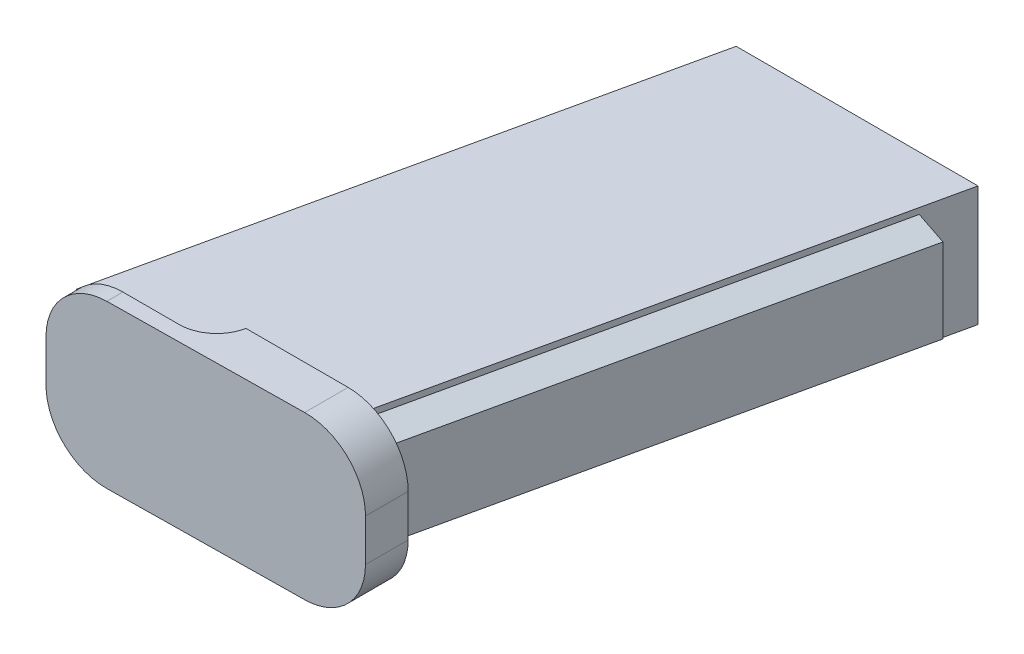
ISO-10303-21;
HEADER;
FILE_DESCRIPTION(('STEP AP214'),'2;1');
FILE_NAME('part.step','',(''),(''),'','','');
FILE_SCHEMA(('AUTOMOTIVE_DESIGN { 1 0 10303 214 1 1 1 1 }'));
ENDSEC;
DATA;
#1=APPLICATION_CONTEXT('core data for automotive mechanical design processes');
#2=APPLICATION_PROTOCOL_DEFINITION('international standard','automotive_design',2000,#1);
#3=PRODUCT_CONTEXT('',#1,'mechanical');
#4=PRODUCT('Part','Part','',(#3));
#5=PRODUCT_RELATED_PRODUCT_CATEGORY('part','',(#4));
#6=PRODUCT_DEFINITION_FORMATION('','',#4);
#7=PRODUCT_DEFINITION_CONTEXT('part definition',#1,'design');
#8=PRODUCT_DEFINITION('design','',#6,#7);
#9=PRODUCT_DEFINITION_SHAPE('','',#8);
#10=(LENGTH_UNIT() NAMED_UNIT(*) SI_UNIT(.MILLI.,.METRE.));
#11=(NAMED_UNIT(*) PLANE_ANGLE_UNIT() SI_UNIT($,.RADIAN.));
#12=(NAMED_UNIT(*) SI_UNIT($,.STERADIAN.) SOLID_ANGLE_UNIT());
#13=UNCERTAINTY_MEASURE_WITH_UNIT(LENGTH_MEASURE(1.E-05),#10,'distance_accuracy_value','');
#14=(GEOMETRIC_REPRESENTATION_CONTEXT(3) GLOBAL_UNCERTAINTY_ASSIGNED_CONTEXT((#13)) GLOBAL_UNIT_ASSIGNED_CONTEXT((#10,
#11,#12)) REPRESENTATION_CONTEXT('',''));
#15=CARTESIAN_POINT('',(0.,0.,0.));
#16=DIRECTION('',(0.,0.,1.));
#17=DIRECTION('',(1.,0.,0.));
#18=AXIS2_PLACEMENT_3D('',#15,#16,#17);
#19=CARTESIAN_POINT('',(211.375504234211,3.49999999999999,-80.9370144957781));
#20=DIRECTION('',(1.,0.,0.));
#21=DIRECTION('',(0.,0.,-1.));
#22=AXIS2_PLACEMENT_3D('',#19,#20,#21);
#23=PLANE('',#22);
#24=DIRECTION('',(0.,1.,0.));
#25=VECTOR('',#24,1.);
#26=CARTESIAN_POINT('',(211.375504234211,3.49999999999999,-90.9370144957781));
#27=LINE('',#26,#25);
#28=CARTESIAN_POINT('',(211.375504234211,-3.5,-90.9370144957781));
#29=VERTEX_POINT('',#28);
#30=CARTESIAN_POINT('',(211.375504234211,3.49999999999999,-90.9370144957781));
#31=VERTEX_POINT('',#30);
#32=EDGE_CURVE('E11',#29,#31,#27,.T.);
#33=ORIENTED_EDGE('',*,*,#32,.F.);
#34=DIRECTION('',(0.,0.,-1.));
#35=VECTOR('',#34,1.);
#36=CARTESIAN_POINT('',(211.375504234211,-3.5,-80.9370144957781));
#37=LINE('',#36,#35);
#38=CARTESIAN_POINT('',(211.375504234211,-3.5,-88.1302440768441));
#39=VERTEX_POINT('',#38);
#40=EDGE_CURVE('E292',#39,#29,#37,.T.);
#41=ORIENTED_EDGE('',*,*,#40,.F.);
#42=DIRECTION('',(0.,1.,0.));
#43=VECTOR('',#42,1.);
#44=CARTESIAN_POINT('',(211.375504234211,3.49999999999999,-88.1302440768441));
#45=LINE('',#44,#43);
#46=CARTESIAN_POINT('',(211.375504234211,3.49999999999999,-88.1302440768441));
#47=VERTEX_POINT('',#46);
#48=EDGE_CURVE('E257',#39,#47,#45,.T.);
#49=ORIENTED_EDGE('',*,*,#48,.T.);
#50=DIRECTION('',(0.,0.,-1.));
#51=VECTOR('',#50,1.);
#52=CARTESIAN_POINT('',(211.375504234211,3.49999999999999,-80.9370144957781));
#53=LINE('',#52,#51);
#54=EDGE_CURVE('E295',#47,#31,#53,.T.);
#55=ORIENTED_EDGE('',*,*,#54,.T.);
#56=EDGE_LOOP('',(#33,#41,#49,#55));
#57=FACE_BOUND('',#56,.T.);
#58=ADVANCED_FACE('F35',(#57),#23,.F.);
#59=CARTESIAN_POINT('',(253.875504234211,-3.5,-95.9370144957781));
#60=DIRECTION('',(0.,0.,1.));
#61=DIRECTION('',(1.,0.,0.));
#62=AXIS2_PLACEMENT_3D('',#59,#60,#61);
#63=PLANE('',#62);
#64=DIRECTION('',(0.,-1.,0.));
#65=VECTOR('',#64,1.);
#66=CARTESIAN_POINT('',(236.875504234211,-10.,-95.9370144957781));
#67=LINE('',#66,#65);
#68=CARTESIAN_POINT('',(236.875504234211,-10.,-95.9370144957781));
#69=VERTEX_POINT('',#68);
#70=CARTESIAN_POINT('',(236.875504234211,-13.5,-95.9370144957781));
#71=VERTEX_POINT('',#70);
#72=EDGE_CURVE('E57',#69,#71,#67,.T.);
#73=ORIENTED_EDGE('',*,*,#72,.F.);
#74=DIRECTION('',(1.,0.,0.));
#75=VECTOR('',#74,1.);
#76=CARTESIAN_POINT('',(218.22457797913,-10.,-95.9370144957781));
#77=LINE('',#76,#75);
#78=CARTESIAN_POINT('',(254.949012168544,-10.,-95.9370144957781));
#79=VERTEX_POINT('',#78);
#80=EDGE_CURVE('E358',#69,#79,#77,.T.);
#81=ORIENTED_EDGE('',*,*,#80,.T.);
#82=DIRECTION('',(0.,1.,0.));
#83=VECTOR('',#82,1.);
#84=CARTESIAN_POINT('',(254.949012168544,-9.,-95.9370144957781));
#85=LINE('',#84,#83);
#86=CARTESIAN_POINT('',(254.949012168544,-9.,-95.9370144957781));
#87=VERTEX_POINT('',#86);
#88=EDGE_CURVE('E331',#79,#87,#85,.T.);
#89=ORIENTED_EDGE('',*,*,#88,.T.);
#90=DIRECTION('',(0.891065968058424,0.453873815689012,0.));
#91=VECTOR('',#90,1.);
#92=CARTESIAN_POINT('',(258.875504234211,-7.,-95.9370144957781));
#93=LINE('',#92,#91);
#94=CARTESIAN_POINT('',(258.875504234211,-7.,-95.9370144957781));
#95=VERTEX_POINT('',#94);
#96=EDGE_CURVE('E328',#87,#95,#93,.T.);
#97=ORIENTED_EDGE('',*,*,#96,.T.);
#98=DIRECTION('',(0.,-1.,0.));
#99=VECTOR('',#98,1.);
#100=CARTESIAN_POINT('',(258.875504234211,10.,-95.9370144957781));
#101=LINE('',#100,#99);
#102=CARTESIAN_POINT('',(258.875504234211,7.,-95.9370144957781));
#103=VERTEX_POINT('',#102);
#104=EDGE_CURVE('E344',#103,#95,#101,.T.);
#105=ORIENTED_EDGE('',*,*,#104,.F.);
#106=DIRECTION('',(-0.891065968058424,0.453873815689012,0.));
#107=VECTOR('',#106,1.);
#108=CARTESIAN_POINT('',(258.875504234211,7.,-95.9370144957781));
#109=LINE('',#108,#107);
#110=CARTESIAN_POINT('',(254.949012168544,8.99999999999999,-95.9370144957781));
#111=VERTEX_POINT('',#110);
#112=EDGE_CURVE('E313',#103,#111,#109,.T.);
#113=ORIENTED_EDGE('',*,*,#112,.T.);
#114=DIRECTION('',(0.,1.,0.));
#115=VECTOR('',#114,1.);
#116=CARTESIAN_POINT('',(254.949012168544,9.,-95.9370144957781));
#117=LINE('',#116,#115);
#118=CARTESIAN_POINT('',(254.949012168544,10.,-95.9370144957781));
#119=VERTEX_POINT('',#118);
#120=EDGE_CURVE('E316',#111,#119,#117,.T.);
#121=ORIENTED_EDGE('',*,*,#120,.T.);
#122=DIRECTION('',(1.,0.,0.));
#123=VECTOR('',#122,1.);
#124=CARTESIAN_POINT('',(218.22457797913,10.,-95.9370144957781));
#125=LINE('',#124,#123);
#126=CARTESIAN_POINT('',(236.875504234211,10.,-95.9370144957781));
#127=VERTEX_POINT('',#126);
#128=EDGE_CURVE('E349',#127,#119,#125,.T.);
#129=ORIENTED_EDGE('',*,*,#128,.F.);
#130=DIRECTION('',(0.,1.,0.));
#131=VECTOR('',#130,1.);
#132=CARTESIAN_POINT('',(236.875504234211,10.,-95.9370144957781));
#133=LINE('',#132,#131);
#134=CARTESIAN_POINT('',(236.875504234211,13.4999999999999,-95.9370144957781));
#135=VERTEX_POINT('',#134);
#136=EDGE_CURVE('E242',#127,#135,#133,.T.);
#137=ORIENTED_EDGE('',*,*,#136,.T.);
#138=DIRECTION('',(-1.,0.,0.));
#139=VECTOR('',#138,1.);
#140=CARTESIAN_POINT('',(253.875504234211,13.5,-95.9370144957781));
#141=LINE('',#140,#139);
#142=CARTESIAN_POINT('',(253.875504234211,13.5,-95.9370144957781));
#143=VERTEX_POINT('',#142);
#144=EDGE_CURVE('E281',#143,#135,#141,.T.);
#145=ORIENTED_EDGE('',*,*,#144,.F.);
#146=CARTESIAN_POINT('',(253.875504234211,3.5,-95.9370144957781));
#147=DIRECTION('',(0.,0.,1.));
#148=DIRECTION('',(-1.,0.,0.));
#149=AXIS2_PLACEMENT_3D('',#146,#147,#148);
#150=CIRCLE('',#149,10.);
#151=CARTESIAN_POINT('',(263.875504234211,3.5,-95.9370144957781));
#152=VERTEX_POINT('',#151);
#153=EDGE_CURVE('E278',#152,#143,#150,.T.);
#154=ORIENTED_EDGE('',*,*,#153,.F.);
#155=DIRECTION('',(0.,1.,0.));
#156=VECTOR('',#155,1.);
#157=CARTESIAN_POINT('',(263.875504234211,3.5,-95.9370144957781));
#158=LINE('',#157,#156);
#159=CARTESIAN_POINT('',(263.875504234211,-3.5,-95.9370144957781));
#160=VERTEX_POINT('',#159);
#161=EDGE_CURVE('E275',#160,#152,#158,.T.);
#162=ORIENTED_EDGE('',*,*,#161,.F.);
#163=CARTESIAN_POINT('',(253.875504234211,-3.5,-95.9370144957781));
#164=DIRECTION('',(0.,0.,1.));
#165=DIRECTION('',(1.,0.,0.));
#166=AXIS2_PLACEMENT_3D('',#163,#164,#165);
#167=CIRCLE('',#166,10.);
#168=CARTESIAN_POINT('',(253.875504234211,-13.5,-95.9370144957781));
#169=VERTEX_POINT('',#168);
#170=EDGE_CURVE('E272',#169,#160,#167,.T.);
#171=ORIENTED_EDGE('',*,*,#170,.F.);
#172=DIRECTION('',(1.,0.,0.));
#173=VECTOR('',#172,1.);
#174=CARTESIAN_POINT('',(253.875504234211,-13.5,-95.9370144957781));
#175=LINE('',#174,#173);
#176=EDGE_CURVE('E284',#71,#169,#175,.T.);
#177=ORIENTED_EDGE('',*,*,#176,.F.);
#178=EDGE_LOOP('',(#73,#81,#89,#97,#105,#113,#121,#129,#137,#145,#154,#162,#171,#177));
#179=FACE_BOUND('',#178,.T.);
#180=ADVANCED_FACE('F404',(#179),#63,.F.);
#181=CARTESIAN_POINT('',(221.375504234211,-3.5,-80.9370144957781));
#182=DIRECTION('',(0.,0.,-1.));
#183=DIRECTION('',(-1.,0.,0.));
#184=AXIS2_PLACEMENT_3D('',#181,#182,#183);
#185=CYLINDRICAL_SURFACE('',#184,10.);
#186=CARTESIAN_POINT('',(221.375504234211,-3.5,-90.9370144957781));
#187=DIRECTION('',(0.,0.,-1.));
#188=DIRECTION('',(-1.,0.,0.));
#189=AXIS2_PLACEMENT_3D('',#186,#187,#188);
#190=CIRCLE('',#189,10.);
#191=CARTESIAN_POINT('',(213.579197966542,-9.76239639281158,-90.9370144957781));
#192=VERTEX_POINT('',#191);
#193=EDGE_CURVE('E49',#192,#29,#190,.T.);
#194=ORIENTED_EDGE('',*,*,#193,.F.);
#195=CARTESIAN_POINT('',(221.375504234211,-3.5,-126.161298506918));
#196=DIRECTION('',(0.976370508497617,0.,0.216103285805896));
#197=DIRECTION('',(0.216103285805896,0.,-0.976370508497617));
#198=AXIS2_PLACEMENT_3D('',#195,#196,#197);
#199=ELLIPSE('',#198,46.2741691442027,10.);
#200=CARTESIAN_POINT('',(213.585837964901,-9.77065382657727,-90.9670144957781));
#201=VERTEX_POINT('',#200);
#202=EDGE_CURVE('E203',#192,#201,#199,.T.);
#203=ORIENTED_EDGE('',*,*,#202,.T.);
#204=CARTESIAN_POINT('',(221.375504234211,-3.5,-90.9670144957781));
#205=DIRECTION('',(0.,0.,-1.));
#206=DIRECTION('',(-1.,0.,0.));
#207=AXIS2_PLACEMENT_3D('',#204,#205,#206);
#208=CIRCLE('',#207,10.);
#209=CARTESIAN_POINT('',(213.776162157426,-10.,-90.9670144957781));
#210=VERTEX_POINT('',#209);
#211=EDGE_CURVE('E373',#201,#210,#208,.F.);
#212=ORIENTED_EDGE('',*,*,#211,.T.);
#213=DIRECTION('',(0.,0.,-1.));
#214=VECTOR('',#213,1.);
#215=CARTESIAN_POINT('',(213.776162157426,-10.,-80.9370144957781));
#216=LINE('',#215,#214);
#217=CARTESIAN_POINT('',(213.776162157426,-10.,-90.9370144957781));
#218=VERTEX_POINT('',#217);
#219=EDGE_CURVE('E227',#218,#210,#216,.T.);
#220=ORIENTED_EDGE('',*,*,#219,.F.);
#221=CARTESIAN_POINT('',(221.375504234211,-3.5,-90.937014495778));
#222=DIRECTION('',(0.,0.,-1.));
#223=DIRECTION('',(-1.,0.,0.));
#224=AXIS2_PLACEMENT_3D('',#221,#222,#223);
#225=CIRCLE('',#224,10.);
#226=CARTESIAN_POINT('',(221.375504234211,-13.4999999999999,-90.937014495778));
#227=VERTEX_POINT('',#226);
#228=EDGE_CURVE('E230',#227,#218,#225,.T.);
#229=ORIENTED_EDGE('',*,*,#228,.F.);
#230=DIRECTION('',(0.,0.,-1.));
#231=VECTOR('',#230,1.);
#232=CARTESIAN_POINT('',(221.375504234211,-13.5,-80.9370144957781));
#233=LINE('',#232,#231);
#234=CARTESIAN_POINT('',(221.375504234211,-13.5,-88.2633296354394));
#235=VERTEX_POINT('',#234);
#236=EDGE_CURVE('E289',#235,#227,#233,.T.);
#237=ORIENTED_EDGE('',*,*,#236,.F.);
#238=CARTESIAN_POINT('',(221.375504234211,-3.5,-88.2633296354394));
#239=DIRECTION('',(-0.0133073774259355,0.,-0.99991145293273));
#240=DIRECTION('',(0.99991145293273,0.,-0.0133073774259355));
#241=AXIS2_PLACEMENT_3D('',#238,#239,#240);
#242=ELLIPSE('',#241,10.0008855490855,10.);
#243=EDGE_CURVE('E254',#235,#39,#242,.T.);
#244=ORIENTED_EDGE('',*,*,#243,.T.);
#245=ORIENTED_EDGE('',*,*,#40,.T.);
#246=EDGE_LOOP('',(#194,#203,#212,#220,#229,#237,#244,#245));
#247=FACE_BOUND('',#246,.T.);
#248=ADVANCED_FACE('F389',(#247),#185,.T.);
#249=CARTESIAN_POINT('',(221.375504234211,3.49999999999999,-80.9370144957781));
#250=DIRECTION('',(0.,0.,-1.));
#251=DIRECTION('',(-1.,0.,0.));
#252=AXIS2_PLACEMENT_3D('',#249,#250,#251);
#253=CYLINDRICAL_SURFACE('',#252,10.);
#254=CARTESIAN_POINT('',(221.375504234211,3.49999999999999,-90.9670144957781));
#255=DIRECTION('',(0.,0.,-1.));
#256=DIRECTION('',(-1.,0.,0.));
#257=AXIS2_PLACEMENT_3D('',#254,#255,#256);
#258=CIRCLE('',#257,10.);
#259=CARTESIAN_POINT('',(213.776162157426,10.,-90.9670144957781));
#260=VERTEX_POINT('',#259);
#261=CARTESIAN_POINT('',(213.585837964901,9.77065382657726,-90.9670144957781));
#262=VERTEX_POINT('',#261);
#263=EDGE_CURVE('E214',#260,#262,#258,.F.);
#264=ORIENTED_EDGE('',*,*,#263,.T.);
#265=CARTESIAN_POINT('',(221.375504234211,3.49999999999999,-126.161298506918));
#266=DIRECTION('',(0.976370508497617,0.,0.216103285805896));
#267=DIRECTION('',(0.216103285805896,0.,-0.976370508497617));
#268=AXIS2_PLACEMENT_3D('',#265,#266,#267);
#269=ELLIPSE('',#268,46.2741691442027,10.);
#270=CARTESIAN_POINT('',(213.579197966542,9.76239639281157,-90.9370144957781));
#271=VERTEX_POINT('',#270);
#272=EDGE_CURVE('E207',#262,#271,#269,.T.);
#273=ORIENTED_EDGE('',*,*,#272,.T.);
#274=CARTESIAN_POINT('',(221.375504234211,3.49999999999999,-90.9370144957781));
#275=DIRECTION('',(0.,0.,-1.));
#276=DIRECTION('',(-1.,0.,0.));
#277=AXIS2_PLACEMENT_3D('',#274,#275,#276);
#278=CIRCLE('',#277,10.);
#279=EDGE_CURVE('E195',#31,#271,#278,.T.);
#280=ORIENTED_EDGE('',*,*,#279,.F.);
#281=ORIENTED_EDGE('',*,*,#54,.F.);
#282=CARTESIAN_POINT('',(221.375504234211,3.49999999999999,-88.2633296354394));
#283=DIRECTION('',(-0.0133073774259355,0.,-0.99991145293273));
#284=DIRECTION('',(0.99991145293273,0.,-0.0133073774259355));
#285=AXIS2_PLACEMENT_3D('',#282,#283,#284);
#286=ELLIPSE('',#285,10.0008855490855,10.);
#287=CARTESIAN_POINT('',(221.375504234211,13.5,-88.2633296354394));
#288=VERTEX_POINT('',#287);
#289=EDGE_CURVE('E260',#47,#288,#286,.T.);
#290=ORIENTED_EDGE('',*,*,#289,.T.);
#291=DIRECTION('',(0.,0.,-1.));
#292=VECTOR('',#291,1.);
#293=CARTESIAN_POINT('',(221.375504234211,13.5,-80.9370144957781));
#294=LINE('',#293,#292);
#295=CARTESIAN_POINT('',(221.375504234211,13.4999999999999,-90.937014495778));
#296=VERTEX_POINT('',#295);
#297=EDGE_CURVE('E297',#288,#296,#294,.T.);
#298=ORIENTED_EDGE('',*,*,#297,.T.);
#299=CARTESIAN_POINT('',(221.375504234211,3.49999999999999,-90.937014495778));
#300=DIRECTION('',(0.,0.,1.));
#301=DIRECTION('',(1.,0.,0.));
#302=AXIS2_PLACEMENT_3D('',#299,#300,#301);
#303=CIRCLE('',#302,10.);
#304=CARTESIAN_POINT('',(213.776162157426,10.,-90.9370144957781));
#305=VERTEX_POINT('',#304);
#306=EDGE_CURVE('E377',#296,#305,#303,.T.);
#307=ORIENTED_EDGE('',*,*,#306,.T.);
#308=DIRECTION('',(0.,0.,-1.));
#309=VECTOR('',#308,1.);
#310=CARTESIAN_POINT('',(213.776162157426,10.,-80.9370144957781));
#311=LINE('',#310,#309);
#312=EDGE_CURVE('E245',#260,#305,#311,.F.);
#313=ORIENTED_EDGE('',*,*,#312,.F.);
#314=EDGE_LOOP('',(#264,#273,#280,#281,#290,#298,#307,#313));
#315=FACE_BOUND('',#314,.T.);
#316=ADVANCED_FACE('F212',(#315),#253,.T.);
#317=CARTESIAN_POINT('',(233.49919304347,-10.,-180.937014495778));
#318=DIRECTION('',(-0.976370508497617,0.,-0.216103285805896));
#319=DIRECTION('',(-0.216103285805896,0.,0.976370508497617));
#320=AXIS2_PLACEMENT_3D('',#317,#318,#319);
#321=PLANE('',#320);
#322=DIRECTION('',(-0.216103285805896,0.,0.976370508497617));
#323=VECTOR('',#322,1.);
#324=CARTESIAN_POINT('',(233.49919304347,-10.,-180.937014495778));
#325=LINE('',#324,#323);
#326=CARTESIAN_POINT('',(233.49919304347,-10.,-180.937014495778));
#327=VERTEX_POINT('',#326);
#328=CARTESIAN_POINT('',(213.585837964901,-10.,-90.9670144957781));
#329=VERTEX_POINT('',#328);
#330=EDGE_CURVE('E356',#327,#329,#325,.T.);
#331=ORIENTED_EDGE('',*,*,#330,.T.);
#332=DIRECTION('',(0.,-1.,0.));
#333=VECTOR('',#332,1.);
#334=CARTESIAN_POINT('',(213.585837964901,-10.,-90.9670144957781));
#335=LINE('',#334,#333);
#336=EDGE_CURVE('E309',#201,#329,#335,.T.);
#337=ORIENTED_EDGE('',*,*,#336,.F.);
#338=ORIENTED_EDGE('',*,*,#202,.F.);
#339=DIRECTION('',(0.,-1.,0.));
#340=VECTOR('',#339,1.);
#341=CARTESIAN_POINT('',(213.579197966542,-10.,-90.9370144957781));
#342=LINE('',#341,#340);
#343=EDGE_CURVE('E198',#271,#192,#342,.T.);
#344=ORIENTED_EDGE('',*,*,#343,.F.);
#345=ORIENTED_EDGE('',*,*,#272,.F.);
#346=CARTESIAN_POINT('',(213.585837964901,10.,-90.9670144957781));
#347=VERTEX_POINT('',#346);
#348=EDGE_CURVE('E310',#347,#262,#335,.T.);
#349=ORIENTED_EDGE('',*,*,#348,.F.);
#350=DIRECTION('',(-0.216103285805896,0.,0.976370508497617));
#351=VECTOR('',#350,1.);
#352=CARTESIAN_POINT('',(233.49919304347,10.,-180.937014495778));
#353=LINE('',#352,#351);
#354=CARTESIAN_POINT('',(233.49919304347,10.,-180.937014495778));
#355=VERTEX_POINT('',#354);
#356=EDGE_CURVE('E347',#355,#347,#353,.T.);
#357=ORIENTED_EDGE('',*,*,#356,.F.);
#358=DIRECTION('',(0.,1.,0.));
#359=VECTOR('',#358,1.);
#360=CARTESIAN_POINT('',(233.49919304347,-10.,-180.937014495778));
#361=LINE('',#360,#359);
#362=EDGE_CURVE('E366',#327,#355,#361,.T.);
#363=ORIENTED_EDGE('',*,*,#362,.F.);
#364=EDGE_LOOP('',(#331,#337,#338,#344,#345,#349,#357,#363));
#365=FACE_BOUND('',#364,.T.);
#366=ADVANCED_FACE('F37',(#365),#321,.T.);
#367=CARTESIAN_POINT('',(0.,-10.,0.));
#368=DIRECTION('',(0.,1.,0.));
#369=DIRECTION('',(0.,0.,1.));
#370=AXIS2_PLACEMENT_3D('',#367,#368,#369);
#371=PLANE('',#370);
#372=DIRECTION('',(-1.,0.,0.));
#373=VECTOR('',#372,1.);
#374=CARTESIAN_POINT('',(229.048865125982,-10.,-90.9670144957781));
#375=LINE('',#374,#373);
#376=EDGE_CURVE('E306',#210,#329,#375,.T.);
#377=ORIENTED_EDGE('',*,*,#376,.T.);
#378=ORIENTED_EDGE('',*,*,#330,.F.);
#379=DIRECTION('',(-1.,0.,0.));
#380=VECTOR('',#379,1.);
#381=CARTESIAN_POINT('',(273.76234085231,-10.,-180.937014495778));
#382=LINE('',#381,#380);
#383=CARTESIAN_POINT('',(273.76234085231,-10.,-180.937014495778));
#384=VERTEX_POINT('',#383);
#385=EDGE_CURVE('E362',#384,#327,#382,.T.);
#386=ORIENTED_EDGE('',*,*,#385,.F.);
#387=DIRECTION('',(0.216103285805896,0.,-0.976370508497617));
#388=VECTOR('',#387,1.);
#389=CARTESIAN_POINT('',(254.949012168544,-10.,-95.9370144957781));
#390=LINE('',#389,#388);
#391=EDGE_CURVE('E360',#79,#384,#390,.T.);
#392=ORIENTED_EDGE('',*,*,#391,.F.);
#393=ORIENTED_EDGE('',*,*,#80,.F.);
#394=CARTESIAN_POINT('',(230.757405295265,-10.,-97.180127958452));
#395=DIRECTION('',(0.,1.,0.));
#396=DIRECTION('',(0.,0.,1.));
#397=AXIS2_PLACEMENT_3D('',#394,#395,#396);
#398=CIRCLE('',#397,6.24311346267399);
#399=CARTESIAN_POINT('',(230.757405295265,-10.,-90.937014495778));
#400=VERTEX_POINT('',#399);
#401=EDGE_CURVE('E220',#400,#69,#398,.T.);
#402=ORIENTED_EDGE('',*,*,#401,.F.);
#403=DIRECTION('',(1.,0.,0.));
#404=VECTOR('',#403,1.);
#405=CARTESIAN_POINT('',(208.,-10.,-90.9370144957781));
#406=LINE('',#405,#404);
#407=EDGE_CURVE('E222',#218,#400,#406,.T.);
#408=ORIENTED_EDGE('',*,*,#407,.F.);
#409=ORIENTED_EDGE('',*,*,#219,.T.);
#410=EDGE_LOOP('',(#377,#378,#386,#392,#393,#402,#408,#409));
#411=FACE_BOUND('',#410,.T.);
#412=ADVANCED_FACE('F427',(#411),#371,.F.);
#413=CARTESIAN_POINT('',(0.,10.,0.));
#414=DIRECTION('',(0.,1.,0.));
#415=DIRECTION('',(0.,0.,1.));
#416=AXIS2_PLACEMENT_3D('',#413,#414,#415);
#417=PLANE('',#416);
#418=ORIENTED_EDGE('',*,*,#356,.T.);
#419=DIRECTION('',(-1.,0.,0.));
#420=VECTOR('',#419,1.);
#421=CARTESIAN_POINT('',(0.,10.,-90.9670144957781));
#422=LINE('',#421,#420);
#423=EDGE_CURVE('E368',#260,#347,#422,.T.);
#424=ORIENTED_EDGE('',*,*,#423,.F.);
#425=ORIENTED_EDGE('',*,*,#312,.T.);
#426=DIRECTION('',(1.,0.,0.));
#427=VECTOR('',#426,1.);
#428=CARTESIAN_POINT('',(208.,10.,-90.9370144957781));
#429=LINE('',#428,#427);
#430=CARTESIAN_POINT('',(230.757405295265,10.,-90.937014495778));
#431=VERTEX_POINT('',#430);
#432=EDGE_CURVE('E233',#305,#431,#429,.T.);
#433=ORIENTED_EDGE('',*,*,#432,.T.);
#434=CARTESIAN_POINT('',(230.757405295265,10.,-97.180127958452));
#435=DIRECTION('',(0.,1.,0.));
#436=DIRECTION('',(0.,0.,1.));
#437=AXIS2_PLACEMENT_3D('',#434,#435,#436);
#438=CIRCLE('',#437,6.24311346267399);
#439=EDGE_CURVE('E235',#431,#127,#438,.T.);
#440=ORIENTED_EDGE('',*,*,#439,.T.);
#441=ORIENTED_EDGE('',*,*,#128,.T.);
#442=DIRECTION('',(0.216103285805896,0.,-0.976370508497617));
#443=VECTOR('',#442,1.);
#444=CARTESIAN_POINT('',(254.949012168544,10.,-95.9370144957781));
#445=LINE('',#444,#443);
#446=CARTESIAN_POINT('',(273.76234085231,10.,-180.937014495778));
#447=VERTEX_POINT('',#446);
#448=EDGE_CURVE('E351',#119,#447,#445,.T.);
#449=ORIENTED_EDGE('',*,*,#448,.T.);
#450=DIRECTION('',(-1.,0.,0.));
#451=VECTOR('',#450,1.);
#452=CARTESIAN_POINT('',(273.76234085231,10.,-180.937014495778));
#453=LINE('',#452,#451);
#454=EDGE_CURVE('E353',#447,#355,#453,.T.);
#455=ORIENTED_EDGE('',*,*,#454,.T.);
#456=EDGE_LOOP('',(#418,#424,#425,#433,#440,#441,#449,#455));
#457=FACE_BOUND('',#456,.T.);
#458=ADVANCED_FACE('F455',(#457),#417,.T.);
#459=CARTESIAN_POINT('',(254.949012168544,-10.,-95.9370144957781));
#460=DIRECTION('',(0.976370508497617,0.,0.216103285805896));
#461=DIRECTION('',(0.216103285805896,0.,-0.976370508497617));
#462=AXIS2_PLACEMENT_3D('',#459,#460,#461);
#463=PLANE('',#462);
#464=ORIENTED_EDGE('',*,*,#448,.F.);
#465=ORIENTED_EDGE('',*,*,#120,.F.);
#466=DIRECTION('',(0.216103285805896,0.,-0.976370508497617));
#467=VECTOR('',#466,1.);
#468=CARTESIAN_POINT('',(254.949012168544,9.,-95.9370144957781));
#469=LINE('',#468,#467);
#470=CARTESIAN_POINT('',(271.99167462325,9.,-172.937014495778));
#471=VERTEX_POINT('',#470);
#472=EDGE_CURVE('E324',#111,#471,#469,.T.);
#473=ORIENTED_EDGE('',*,*,#472,.T.);
#474=DIRECTION('',(0.,-1.,0.));
#475=VECTOR('',#474,1.);
#476=CARTESIAN_POINT('',(271.99167462325,10.,-172.937014495778));
#477=LINE('',#476,#475);
#478=CARTESIAN_POINT('',(271.99167462325,-9.,-172.937014495778));
#479=VERTEX_POINT('',#478);
#480=EDGE_CURVE('E326',#471,#479,#477,.T.);
#481=ORIENTED_EDGE('',*,*,#480,.T.);
#482=DIRECTION('',(0.216103285805896,0.,-0.976370508497617));
#483=VECTOR('',#482,1.);
#484=CARTESIAN_POINT('',(254.949012168544,-9.,-95.9370144957781));
#485=LINE('',#484,#483);
#486=EDGE_CURVE('E323',#87,#479,#485,.T.);
#487=ORIENTED_EDGE('',*,*,#486,.F.);
#488=ORIENTED_EDGE('',*,*,#88,.F.);
#489=ORIENTED_EDGE('',*,*,#391,.T.);
#490=DIRECTION('',(0.,1.,0.));
#491=VECTOR('',#490,1.);
#492=CARTESIAN_POINT('',(273.76234085231,-10.,-180.937014495778));
#493=LINE('',#492,#491);
#494=EDGE_CURVE('E365',#384,#447,#493,.T.);
#495=ORIENTED_EDGE('',*,*,#494,.T.);
#496=EDGE_LOOP('',(#464,#465,#473,#481,#487,#488,#489,#495));
#497=FACE_BOUND('',#496,.T.);
#498=ADVANCED_FACE('F436',(#497),#463,.T.);
#499=CARTESIAN_POINT('',(273.76234085231,-10.,-180.937014495778));
#500=DIRECTION('',(0.,0.,-1.));
#501=DIRECTION('',(-1.,0.,0.));
#502=AXIS2_PLACEMENT_3D('',#499,#500,#501);
#503=PLANE('',#502);
#504=ORIENTED_EDGE('',*,*,#362,.T.);
#505=ORIENTED_EDGE('',*,*,#454,.F.);
#506=ORIENTED_EDGE('',*,*,#494,.F.);
#507=ORIENTED_EDGE('',*,*,#385,.T.);
#508=EDGE_LOOP('',(#504,#505,#506,#507));
#509=FACE_BOUND('',#508,.T.);
#510=ADVANCED_FACE('F459',(#509),#503,.T.);
#511=CARTESIAN_POINT('',(275.918166688917,10.,-172.937014495778));
#512=DIRECTION('',(-0.976370508497617,0.,-0.216103285805896));
#513=DIRECTION('',(-0.216103285805896,0.,0.976370508497617));
#514=AXIS2_PLACEMENT_3D('',#511,#512,#513);
#515=PLANE('',#514);
#516=DIRECTION('',(0.,-1.,0.));
#517=VECTOR('',#516,1.);
#518=CARTESIAN_POINT('',(275.918166688917,10.,-172.937014495778));
#519=LINE('',#518,#517);
#520=CARTESIAN_POINT('',(275.918166688917,6.99999999999999,-172.937014495778));
#521=VERTEX_POINT('',#520);
#522=CARTESIAN_POINT('',(275.918166688917,-7.,-172.937014495778));
#523=VERTEX_POINT('',#522);
#524=EDGE_CURVE('E341',#521,#523,#519,.T.);
#525=ORIENTED_EDGE('',*,*,#524,.F.);
#526=DIRECTION('',(0.216103285805896,0.,-0.976370508497617));
#527=VECTOR('',#526,1.);
#528=CARTESIAN_POINT('',(258.875504234211,7.,-95.9370144957781));
#529=LINE('',#528,#527);
#530=EDGE_CURVE('E320',#103,#521,#529,.T.);
#531=ORIENTED_EDGE('',*,*,#530,.F.);
#532=ORIENTED_EDGE('',*,*,#104,.T.);
#533=DIRECTION('',(0.216103285805896,0.,-0.976370508497617));
#534=VECTOR('',#533,1.);
#535=CARTESIAN_POINT('',(258.875504234211,-7.,-95.9370144957781));
#536=LINE('',#535,#534);
#537=EDGE_CURVE('E334',#95,#523,#536,.T.);
#538=ORIENTED_EDGE('',*,*,#537,.T.);
#539=EDGE_LOOP('',(#525,#531,#532,#538));
#540=FACE_BOUND('',#539,.T.);
#541=ADVANCED_FACE('F445',(#540),#515,.F.);
#542=CARTESIAN_POINT('',(271.99167462325,10.,-172.937014495778));
#543=DIRECTION('',(0.,0.,1.));
#544=DIRECTION('',(1.,0.,0.));
#545=AXIS2_PLACEMENT_3D('',#542,#543,#544);
#546=PLANE('',#545);
#547=ORIENTED_EDGE('',*,*,#480,.F.);
#548=DIRECTION('',(-0.891065968058424,0.453873815689012,0.));
#549=VECTOR('',#548,1.);
#550=CARTESIAN_POINT('',(275.918166688917,7.,-172.937014495778));
#551=LINE('',#550,#549);
#552=EDGE_CURVE('E317',#521,#471,#551,.T.);
#553=ORIENTED_EDGE('',*,*,#552,.F.);
#554=ORIENTED_EDGE('',*,*,#524,.T.);
#555=DIRECTION('',(0.891065968058424,0.453873815689012,0.));
#556=VECTOR('',#555,1.);
#557=CARTESIAN_POINT('',(275.918166688917,-7.,-172.937014495778));
#558=LINE('',#557,#556);
#559=EDGE_CURVE('E312',#479,#523,#558,.T.);
#560=ORIENTED_EDGE('',*,*,#559,.F.);
#561=EDGE_LOOP('',(#547,#553,#554,#560));
#562=FACE_BOUND('',#561,.T.);
#563=ADVANCED_FACE('F452',(#562),#546,.F.);
#564=CARTESIAN_POINT('',(258.875504234211,-7.,-95.9370144957781));
#565=DIRECTION('',(-0.451600829171601,0.886603536295435,-0.0999542921537233));
#566=DIRECTION('',(-0.891065968058424,-0.453873815689012,0.));
#567=AXIS2_PLACEMENT_3D('',#564,#565,#566);
#568=PLANE('',#567);
#569=ORIENTED_EDGE('',*,*,#559,.T.);
#570=ORIENTED_EDGE('',*,*,#537,.F.);
#571=ORIENTED_EDGE('',*,*,#96,.F.);
#572=ORIENTED_EDGE('',*,*,#486,.T.);
#573=EDGE_LOOP('',(#569,#570,#571,#572));
#574=FACE_BOUND('',#573,.T.);
#575=ADVANCED_FACE('F440',(#574),#568,.F.);
#576=CARTESIAN_POINT('',(258.875504234211,7.,-95.9370144957781));
#577=DIRECTION('',(-0.451600829171601,-0.886603536295435,-0.0999542921537233));
#578=DIRECTION('',(0.891065968058424,-0.453873815689012,0.));
#579=AXIS2_PLACEMENT_3D('',#576,#577,#578);
#580=PLANE('',#579);
#581=ORIENTED_EDGE('',*,*,#552,.T.);
#582=ORIENTED_EDGE('',*,*,#472,.F.);
#583=ORIENTED_EDGE('',*,*,#112,.F.);
#584=ORIENTED_EDGE('',*,*,#530,.T.);
#585=EDGE_LOOP('',(#581,#582,#583,#584));
#586=FACE_BOUND('',#585,.T.);
#587=ADVANCED_FACE('F448',(#586),#580,.F.);
#588=CARTESIAN_POINT('',(253.875504234211,-3.5,-80.9370144957781));
#589=DIRECTION('',(0.,0.,-1.));
#590=DIRECTION('',(-1.,0.,0.));
#591=AXIS2_PLACEMENT_3D('',#588,#589,#590);
#592=CYLINDRICAL_SURFACE('',#591,10.);
#593=DIRECTION('',(0.,0.,-1.));
#594=VECTOR('',#593,1.);
#595=CARTESIAN_POINT('',(263.875504234211,-3.5,-80.9370144957781));
#596=LINE('',#595,#594);
#597=CARTESIAN_POINT('',(263.875504234211,-3.5,-88.8289432594693));
#598=VERTEX_POINT('',#597);
#599=EDGE_CURVE('E304',#598,#160,#596,.T.);
#600=ORIENTED_EDGE('',*,*,#599,.F.);
#601=CARTESIAN_POINT('',(253.875504234211,-3.5,-88.695857700874));
#602=DIRECTION('',(-0.0133073774259355,0.,-0.99991145293273));
#603=DIRECTION('',(0.99991145293273,0.,-0.0133073774259355));
#604=AXIS2_PLACEMENT_3D('',#601,#602,#603);
#605=ELLIPSE('',#604,10.0008855490855,10.);
#606=CARTESIAN_POINT('',(253.875504234211,-13.5,-88.695857700874));
#607=VERTEX_POINT('',#606);
#608=EDGE_CURVE('E269',#598,#607,#605,.T.);
#609=ORIENTED_EDGE('',*,*,#608,.T.);
#610=DIRECTION('',(0.,0.,-1.));
#611=VECTOR('',#610,1.);
#612=CARTESIAN_POINT('',(253.875504234211,-13.5,-80.9370144957781));
#613=LINE('',#612,#611);
#614=EDGE_CURVE('E286',#607,#169,#613,.T.);
#615=ORIENTED_EDGE('',*,*,#614,.T.);
#616=ORIENTED_EDGE('',*,*,#170,.T.);
#617=EDGE_LOOP('',(#600,#609,#615,#616));
#618=FACE_BOUND('',#617,.T.);
#619=ADVANCED_FACE('F396',(#618),#592,.T.);
#620=CARTESIAN_POINT('',(263.875504234211,3.5,-80.9370144957781));
#621=DIRECTION('',(-1.,0.,0.));
#622=DIRECTION('',(0.,0.,1.));
#623=AXIS2_PLACEMENT_3D('',#620,#621,#622);
#624=PLANE('',#623);
#625=DIRECTION('',(0.,0.,-1.));
#626=VECTOR('',#625,1.);
#627=CARTESIAN_POINT('',(263.875504234211,3.5,-80.9370144957781));
#628=LINE('',#627,#626);
#629=CARTESIAN_POINT('',(263.875504234211,3.5,-88.8289432594693));
#630=VERTEX_POINT('',#629);
#631=EDGE_CURVE('E302',#630,#152,#628,.T.);
#632=ORIENTED_EDGE('',*,*,#631,.F.);
#633=DIRECTION('',(0.,-1.,0.));
#634=VECTOR('',#633,1.);
#635=CARTESIAN_POINT('',(263.875504234211,3.5,-88.8289432594693));
#636=LINE('',#635,#634);
#637=EDGE_CURVE('E266',#630,#598,#636,.T.);
#638=ORIENTED_EDGE('',*,*,#637,.T.);
#639=ORIENTED_EDGE('',*,*,#599,.T.);
#640=ORIENTED_EDGE('',*,*,#161,.T.);
#641=EDGE_LOOP('',(#632,#638,#639,#640));
#642=FACE_BOUND('',#641,.T.);
#643=ADVANCED_FACE('F401',(#642),#624,.F.);
#644=CARTESIAN_POINT('',(253.875504234211,3.5,-80.9370144957781));
#645=DIRECTION('',(0.,0.,-1.));
#646=DIRECTION('',(-1.,0.,0.));
#647=AXIS2_PLACEMENT_3D('',#644,#645,#646);
#648=CYLINDRICAL_SURFACE('',#647,10.);
#649=DIRECTION('',(0.,0.,-1.));
#650=VECTOR('',#649,1.);
#651=CARTESIAN_POINT('',(253.875504234211,13.5,-80.9370144957781));
#652=LINE('',#651,#650);
#653=CARTESIAN_POINT('',(253.875504234211,13.5,-88.695857700874));
#654=VERTEX_POINT('',#653);
#655=EDGE_CURVE('E300',#654,#143,#652,.T.);
#656=ORIENTED_EDGE('',*,*,#655,.F.);
#657=CARTESIAN_POINT('',(253.875504234211,3.5,-88.695857700874));
#658=DIRECTION('',(-0.0133073774259355,0.,-0.99991145293273));
#659=DIRECTION('',(0.99991145293273,0.,-0.0133073774259355));
#660=AXIS2_PLACEMENT_3D('',#657,#658,#659);
#661=ELLIPSE('',#660,10.0008855490855,10.);
#662=EDGE_CURVE('E263',#654,#630,#661,.T.);
#663=ORIENTED_EDGE('',*,*,#662,.T.);
#664=ORIENTED_EDGE('',*,*,#631,.T.);
#665=ORIENTED_EDGE('',*,*,#153,.T.);
#666=EDGE_LOOP('',(#656,#663,#664,#665));
#667=FACE_BOUND('',#666,.T.);
#668=ADVANCED_FACE('F409',(#667),#648,.T.);
#669=CARTESIAN_POINT('',(253.875504234211,13.5,-80.9370144957781));
#670=DIRECTION('',(0.,-1.,0.));
#671=DIRECTION('',(1.,0.,0.));
#672=AXIS2_PLACEMENT_3D('',#669,#670,#671);
#673=PLANE('',#672);
#674=ORIENTED_EDGE('',*,*,#144,.T.);
#675=CARTESIAN_POINT('',(230.757405295265,13.4999999999999,-97.180127958452));
#676=DIRECTION('',(0.,1.,0.));
#677=DIRECTION('',(0.,0.,1.));
#678=AXIS2_PLACEMENT_3D('',#675,#676,#677);
#679=CIRCLE('',#678,6.24311346267399);
#680=CARTESIAN_POINT('',(230.757405295265,13.4999999999999,-90.937014495778));
#681=VERTEX_POINT('',#680);
#682=EDGE_CURVE('E236',#681,#135,#679,.T.);
#683=ORIENTED_EDGE('',*,*,#682,.F.);
#684=DIRECTION('',(1.,0.,0.));
#685=VECTOR('',#684,1.);
#686=CARTESIAN_POINT('',(208.,13.4999999999999,-90.9370144957781));
#687=LINE('',#686,#685);
#688=EDGE_CURVE('E232',#296,#681,#687,.T.);
#689=ORIENTED_EDGE('',*,*,#688,.F.);
#690=ORIENTED_EDGE('',*,*,#297,.F.);
#691=DIRECTION('',(-0.99991145293273,0.,0.0133073774259355));
#692=VECTOR('',#691,1.);
#693=CARTESIAN_POINT('',(268.062661222196,13.5,-88.8846682721365));
#694=LINE('',#693,#692);
#695=EDGE_CURVE('E249',#654,#288,#694,.T.);
#696=ORIENTED_EDGE('',*,*,#695,.F.);
#697=ORIENTED_EDGE('',*,*,#655,.T.);
#698=EDGE_LOOP('',(#674,#683,#689,#690,#696,#697));
#699=FACE_BOUND('',#698,.T.);
#700=ADVANCED_FACE('F413',(#699),#673,.F.);
#701=CARTESIAN_POINT('',(253.875504234211,-13.5,-80.9370144957781));
#702=DIRECTION('',(0.,1.,0.));
#703=DIRECTION('',(0.,0.,1.));
#704=AXIS2_PLACEMENT_3D('',#701,#702,#703);
#705=PLANE('',#704);
#706=DIRECTION('',(-1.,0.,0.));
#707=VECTOR('',#706,1.);
#708=CARTESIAN_POINT('',(253.875504234211,-13.5,-90.937014495778));
#709=LINE('',#708,#707);
#710=CARTESIAN_POINT('',(230.757405295265,-13.4999999999999,-90.937014495778));
#711=VERTEX_POINT('',#710);
#712=EDGE_CURVE('E43',#711,#227,#709,.T.);
#713=ORIENTED_EDGE('',*,*,#712,.F.);
#714=CARTESIAN_POINT('',(230.757405295265,-13.4999999999999,-97.180127958452));
#715=DIRECTION('',(0.,1.,0.));
#716=DIRECTION('',(0.,0.,1.));
#717=AXIS2_PLACEMENT_3D('',#714,#715,#716);
#718=CIRCLE('',#717,6.24311346267399);
#719=EDGE_CURVE('E219',#711,#71,#718,.T.);
#720=ORIENTED_EDGE('',*,*,#719,.T.);
#721=ORIENTED_EDGE('',*,*,#176,.T.);
#722=ORIENTED_EDGE('',*,*,#614,.F.);
#723=DIRECTION('',(-0.99991145293273,0.,0.0133073774259355));
#724=VECTOR('',#723,1.);
#725=CARTESIAN_POINT('',(268.062661222196,-13.5,-88.8846682721365));
#726=LINE('',#725,#724);
#727=EDGE_CURVE('E251',#607,#235,#726,.T.);
#728=ORIENTED_EDGE('',*,*,#727,.T.);
#729=ORIENTED_EDGE('',*,*,#236,.T.);
#730=EDGE_LOOP('',(#713,#720,#721,#722,#728,#729));
#731=FACE_BOUND('',#730,.T.);
#732=ADVANCED_FACE('F390',(#731),#705,.F.);
#733=CARTESIAN_POINT('',(229.048865125982,-10.,-90.9670144957781));
#734=DIRECTION('',(0.,0.,-1.));
#735=DIRECTION('',(-1.,0.,0.));
#736=AXIS2_PLACEMENT_3D('',#733,#734,#735);
#737=PLANE('',#736);
#738=ORIENTED_EDGE('',*,*,#211,.F.);
#739=ORIENTED_EDGE('',*,*,#336,.T.);
#740=ORIENTED_EDGE('',*,*,#376,.F.);
#741=EDGE_LOOP('',(#738,#739,#740));
#742=FACE_BOUND('',#741,.T.);
#743=ADVANCED_FACE('F422',(#742),#737,.F.);
#744=ORIENTED_EDGE('',*,*,#263,.F.);
#745=ORIENTED_EDGE('',*,*,#423,.T.);
#746=ORIENTED_EDGE('',*,*,#348,.T.);
#747=EDGE_LOOP('',(#744,#745,#746));
#748=FACE_BOUND('',#747,.T.);
#749=ADVANCED_FACE('F462',(#748),#737,.F.);
#750=CARTESIAN_POINT('',(268.062661222196,-13.5,-88.8846682721365));
#751=DIRECTION('',(-0.0133073774259355,0.,-0.99991145293273));
#752=DIRECTION('',(-0.99991145293273,0.,0.0133073774259355));
#753=AXIS2_PLACEMENT_3D('',#750,#751,#752);
#754=PLANE('',#753);
#755=ORIENTED_EDGE('',*,*,#637,.F.);
#756=ORIENTED_EDGE('',*,*,#662,.F.);
#757=ORIENTED_EDGE('',*,*,#695,.T.);
#758=ORIENTED_EDGE('',*,*,#289,.F.);
#759=ORIENTED_EDGE('',*,*,#48,.F.);
#760=ORIENTED_EDGE('',*,*,#243,.F.);
#761=ORIENTED_EDGE('',*,*,#727,.F.);
#762=ORIENTED_EDGE('',*,*,#608,.F.);
#763=EDGE_LOOP('',(#755,#756,#757,#758,#759,#760,#761,#762));
#764=FACE_BOUND('',#763,.T.);
#765=ADVANCED_FACE('F393',(#764),#754,.F.);
#766=CARTESIAN_POINT('',(208.,10.,-90.9370144957781));
#767=DIRECTION('',(0.,0.,1.));
#768=DIRECTION('',(1.,0.,0.));
#769=AXIS2_PLACEMENT_3D('',#766,#767,#768);
#770=PLANE('',#769);
#771=ORIENTED_EDGE('',*,*,#688,.T.);
#772=DIRECTION('',(0.,1.,0.));
#773=VECTOR('',#772,1.);
#774=CARTESIAN_POINT('',(230.757405295265,10.,-90.937014495778));
#775=LINE('',#774,#773);
#776=EDGE_CURVE('E239',#431,#681,#775,.T.);
#777=ORIENTED_EDGE('',*,*,#776,.F.);
#778=ORIENTED_EDGE('',*,*,#432,.F.);
#779=ORIENTED_EDGE('',*,*,#306,.F.);
#780=EDGE_LOOP('',(#771,#777,#778,#779));
#781=FACE_BOUND('',#780,.T.);
#782=ADVANCED_FACE('F466',(#781),#770,.F.);
#783=CARTESIAN_POINT('',(230.757405295265,10.,-97.180127958452));
#784=DIRECTION('',(0.,1.,0.));
#785=DIRECTION('',(0.,0.,1.));
#786=AXIS2_PLACEMENT_3D('',#783,#784,#785);
#787=CYLINDRICAL_SURFACE('',#786,6.24311346267399);
#788=ORIENTED_EDGE('',*,*,#682,.T.);
#789=ORIENTED_EDGE('',*,*,#136,.F.);
#790=ORIENTED_EDGE('',*,*,#439,.F.);
#791=ORIENTED_EDGE('',*,*,#776,.T.);
#792=EDGE_LOOP('',(#788,#789,#790,#791));
#793=FACE_BOUND('',#792,.T.);
#794=ADVANCED_FACE('F468',(#793),#787,.F.);
#795=CARTESIAN_POINT('',(208.,-10.,-90.9370144957781));
#796=DIRECTION('',(0.,0.,-1.));
#797=DIRECTION('',(-1.,0.,0.));
#798=AXIS2_PLACEMENT_3D('',#795,#796,#797);
#799=PLANE('',#798);
#800=ORIENTED_EDGE('',*,*,#228,.T.);
#801=ORIENTED_EDGE('',*,*,#407,.T.);
#802=DIRECTION('',(0.,-1.,0.));
#803=VECTOR('',#802,1.);
#804=CARTESIAN_POINT('',(230.757405295265,-10.,-90.937014495778));
#805=LINE('',#804,#803);
#806=EDGE_CURVE('E225',#400,#711,#805,.T.);
#807=ORIENTED_EDGE('',*,*,#806,.T.);
#808=ORIENTED_EDGE('',*,*,#712,.T.);
#809=EDGE_LOOP('',(#800,#801,#807,#808));
#810=FACE_BOUND('',#809,.T.);
#811=ADVANCED_FACE('F382',(#810),#799,.T.);
#812=CARTESIAN_POINT('',(230.757405295265,-10.,-97.180127958452));
#813=DIRECTION('',(0.,-1.,0.));
#814=DIRECTION('',(0.,0.,-1.));
#815=AXIS2_PLACEMENT_3D('',#812,#813,#814);
#816=CYLINDRICAL_SURFACE('',#815,6.24311346267399);
#817=ORIENTED_EDGE('',*,*,#719,.F.);
#818=ORIENTED_EDGE('',*,*,#806,.F.);
#819=ORIENTED_EDGE('',*,*,#401,.T.);
#820=ORIENTED_EDGE('',*,*,#72,.T.);
#821=EDGE_LOOP('',(#817,#818,#819,#820));
#822=FACE_BOUND('',#821,.T.);
#823=ADVANCED_FACE('F430',(#822),#816,.F.);
#824=CARTESIAN_POINT('',(220.268837841048,-3.5,-90.9370144957781));
#825=DIRECTION('',(0.,0.,-1.));
#826=DIRECTION('',(-1.,0.,0.));
#827=AXIS2_PLACEMENT_3D('',#824,#825,#826);
#828=PLANE('',#827);
#829=ORIENTED_EDGE('',*,*,#193,.T.);
#830=ORIENTED_EDGE('',*,*,#32,.T.);
#831=ORIENTED_EDGE('',*,*,#279,.T.);
#832=ORIENTED_EDGE('',*,*,#343,.T.);
#833=EDGE_LOOP('',(#829,#830,#831,#832));
#834=FACE_BOUND('',#833,.T.);
#835=ADVANCED_FACE('F197',(#834),#828,.T.);
#836=CLOSED_SHELL('',(#58,#180,#248,#316,#366,#412,#458,#498,#510,#541,#563,#575,#587,#619,#643,
#668,#700,#732,#743,#749,#765,#782,#794,#811,#823,#835));
#837=MANIFOLD_SOLID_BREP('B2',#836);
#838=ADVANCED_BREP_SHAPE_REPRESENTATION('',(#18,#837),#14);
#839=SHAPE_DEFINITION_REPRESENTATION(#9,#838);
ENDSEC;
END-ISO-10303-21;
